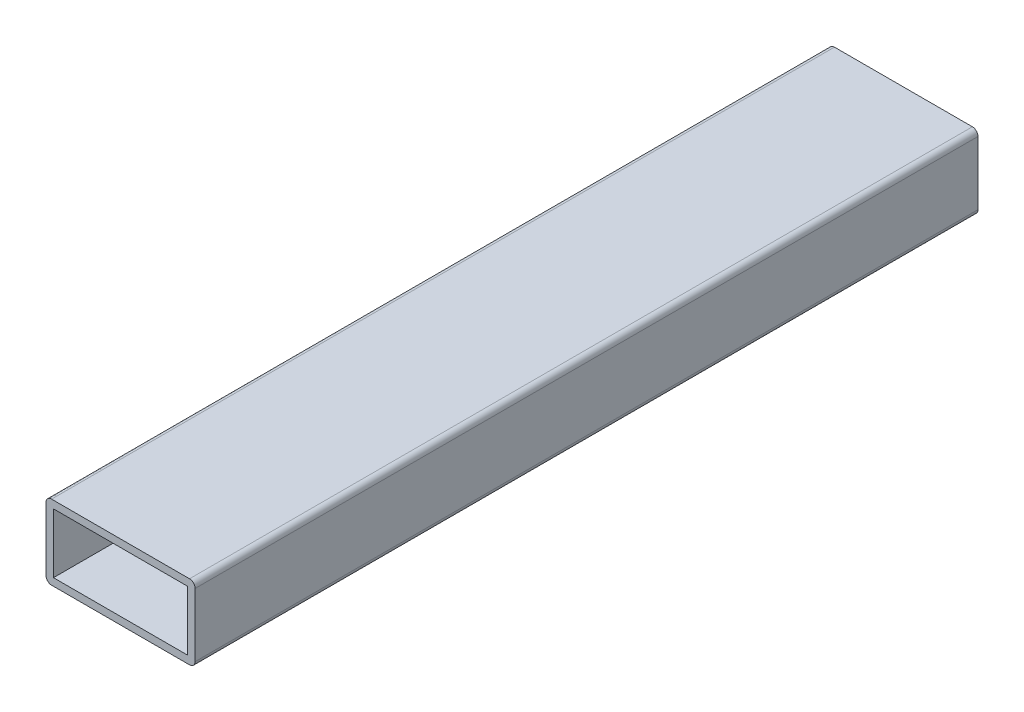
ISO-10303-21;
HEADER;
FILE_DESCRIPTION(('STEP AP214'),'2;1');
FILE_NAME('part.step','',(''),(''),'','','');
FILE_SCHEMA(('AUTOMOTIVE_DESIGN { 1 0 10303 214 1 1 1 1 }'));
ENDSEC;
DATA;
#1=APPLICATION_CONTEXT('core data for automotive mechanical design processes');
#2=APPLICATION_PROTOCOL_DEFINITION('international standard','automotive_design',2000,#1);
#3=PRODUCT_CONTEXT('',#1,'mechanical');
#4=PRODUCT('Part','Part','',(#3));
#5=PRODUCT_RELATED_PRODUCT_CATEGORY('part','',(#4));
#6=PRODUCT_DEFINITION_FORMATION('','',#4);
#7=PRODUCT_DEFINITION_CONTEXT('part definition',#1,'design');
#8=PRODUCT_DEFINITION('design','',#6,#7);
#9=PRODUCT_DEFINITION_SHAPE('','',#8);
#10=(LENGTH_UNIT() NAMED_UNIT(*) SI_UNIT(.MILLI.,.METRE.));
#11=(NAMED_UNIT(*) PLANE_ANGLE_UNIT() SI_UNIT($,.RADIAN.));
#12=(NAMED_UNIT(*) SI_UNIT($,.STERADIAN.) SOLID_ANGLE_UNIT());
#13=UNCERTAINTY_MEASURE_WITH_UNIT(LENGTH_MEASURE(1.E-05),#10,'distance_accuracy_value','');
#14=(GEOMETRIC_REPRESENTATION_CONTEXT(3) GLOBAL_UNCERTAINTY_ASSIGNED_CONTEXT((#13)) GLOBAL_UNIT_ASSIGNED_CONTEXT((#10,
#11,#12)) REPRESENTATION_CONTEXT('',''));
#15=CARTESIAN_POINT('',(0.,0.,0.));
#16=DIRECTION('',(0.,0.,1.));
#17=DIRECTION('',(1.,0.,0.));
#18=AXIS2_PLACEMENT_3D('',#15,#16,#17);
#19=CARTESIAN_POINT('',(37.,-17.,-210.));
#20=DIRECTION('',(0.,0.,1.));
#21=DIRECTION('',(1.,0.,0.));
#22=AXIS2_PLACEMENT_3D('',#19,#20,#21);
#23=CYLINDRICAL_SURFACE('',#22,3.00000000000001);
#24=DIRECTION('',(0.,0.,1.));
#25=VECTOR('',#24,1.);
#26=CARTESIAN_POINT('',(40.,-17.,-210.));
#27=LINE('',#26,#25);
#28=CARTESIAN_POINT('',(40.,-17.,-210.));
#29=VERTEX_POINT('',#28);
#30=CARTESIAN_POINT('',(40.,-17.,210.));
#31=VERTEX_POINT('',#30);
#32=EDGE_CURVE('E37',#29,#31,#27,.T.);
#33=ORIENTED_EDGE('',*,*,#32,.T.);
#34=CARTESIAN_POINT('',(37.,-17.,210.));
#35=DIRECTION('',(0.,0.,1.));
#36=DIRECTION('',(-1.,0.,0.));
#37=AXIS2_PLACEMENT_3D('',#34,#35,#36);
#38=CIRCLE('',#37,3.00000000000001);
#39=CARTESIAN_POINT('',(37.,-20.,210.));
#40=VERTEX_POINT('',#39);
#41=EDGE_CURVE('E153',#40,#31,#38,.T.);
#42=ORIENTED_EDGE('',*,*,#41,.F.);
#43=DIRECTION('',(0.,0.,1.));
#44=VECTOR('',#43,1.);
#45=CARTESIAN_POINT('',(37.,-20.,-210.));
#46=LINE('',#45,#44);
#47=CARTESIAN_POINT('',(37.,-20.,-210.));
#48=VERTEX_POINT('',#47);
#49=EDGE_CURVE('E11',#48,#40,#46,.T.);
#50=ORIENTED_EDGE('',*,*,#49,.F.);
#51=CARTESIAN_POINT('',(37.,-17.,-210.));
#52=DIRECTION('',(0.,0.,1.));
#53=DIRECTION('',(-1.,0.,0.));
#54=AXIS2_PLACEMENT_3D('',#51,#52,#53);
#55=CIRCLE('',#54,3.00000000000001);
#56=EDGE_CURVE('E184',#48,#29,#55,.T.);
#57=ORIENTED_EDGE('',*,*,#56,.T.);
#58=EDGE_LOOP('',(#33,#42,#50,#57));
#59=FACE_BOUND('',#58,.T.);
#60=ADVANCED_FACE('F34',(#59),#23,.T.);
#61=CARTESIAN_POINT('',(-37.,-20.,-210.));
#62=DIRECTION('',(0.,-1.,0.));
#63=DIRECTION('',(0.,0.,-1.));
#64=AXIS2_PLACEMENT_3D('',#61,#62,#63);
#65=PLANE('',#64);
#66=ORIENTED_EDGE('',*,*,#49,.T.);
#67=DIRECTION('',(1.,0.,0.));
#68=VECTOR('',#67,1.);
#69=CARTESIAN_POINT('',(-37.,-20.,210.));
#70=LINE('',#69,#68);
#71=CARTESIAN_POINT('',(-37.,-20.,210.));
#72=VERTEX_POINT('',#71);
#73=EDGE_CURVE('E174',#72,#40,#70,.T.);
#74=ORIENTED_EDGE('',*,*,#73,.F.);
#75=DIRECTION('',(0.,0.,1.));
#76=VECTOR('',#75,1.);
#77=CARTESIAN_POINT('',(-37.,-20.,-210.));
#78=LINE('',#77,#76);
#79=CARTESIAN_POINT('',(-37.,-20.,-210.));
#80=VERTEX_POINT('',#79);
#81=EDGE_CURVE('E42',#80,#72,#78,.T.);
#82=ORIENTED_EDGE('',*,*,#81,.F.);
#83=DIRECTION('',(1.,0.,0.));
#84=VECTOR('',#83,1.);
#85=CARTESIAN_POINT('',(-37.,-20.,-210.));
#86=LINE('',#85,#84);
#87=EDGE_CURVE('E207',#80,#48,#86,.T.);
#88=ORIENTED_EDGE('',*,*,#87,.T.);
#89=EDGE_LOOP('',(#66,#74,#82,#88));
#90=FACE_BOUND('',#89,.T.);
#91=ADVANCED_FACE('F228',(#90),#65,.T.);
#92=CARTESIAN_POINT('',(-37.,-17.,-210.));
#93=DIRECTION('',(0.,0.,1.));
#94=DIRECTION('',(1.,0.,0.));
#95=AXIS2_PLACEMENT_3D('',#92,#93,#94);
#96=CYLINDRICAL_SURFACE('',#95,3.);
#97=ORIENTED_EDGE('',*,*,#81,.T.);
#98=CARTESIAN_POINT('',(-37.,-17.,210.));
#99=DIRECTION('',(0.,0.,1.));
#100=DIRECTION('',(1.,0.,0.));
#101=AXIS2_PLACEMENT_3D('',#98,#99,#100);
#102=CIRCLE('',#101,3.);
#103=CARTESIAN_POINT('',(-40.,-17.,210.));
#104=VERTEX_POINT('',#103);
#105=EDGE_CURVE('E171',#104,#72,#102,.T.);
#106=ORIENTED_EDGE('',*,*,#105,.F.);
#107=DIRECTION('',(0.,0.,1.));
#108=VECTOR('',#107,1.);
#109=CARTESIAN_POINT('',(-40.,-17.,-210.));
#110=LINE('',#109,#108);
#111=CARTESIAN_POINT('',(-40.,-17.,-210.));
#112=VERTEX_POINT('',#111);
#113=EDGE_CURVE('E211',#112,#104,#110,.T.);
#114=ORIENTED_EDGE('',*,*,#113,.F.);
#115=CARTESIAN_POINT('',(-37.,-17.,-210.));
#116=DIRECTION('',(0.,0.,1.));
#117=DIRECTION('',(1.,0.,0.));
#118=AXIS2_PLACEMENT_3D('',#115,#116,#117);
#119=CIRCLE('',#118,3.);
#120=EDGE_CURVE('E204',#112,#80,#119,.T.);
#121=ORIENTED_EDGE('',*,*,#120,.T.);
#122=EDGE_LOOP('',(#97,#106,#114,#121));
#123=FACE_BOUND('',#122,.T.);
#124=ADVANCED_FACE('F249',(#123),#96,.T.);
#125=CARTESIAN_POINT('',(-40.,17.,-210.));
#126=DIRECTION('',(-1.,0.,0.));
#127=DIRECTION('',(0.,0.,1.));
#128=AXIS2_PLACEMENT_3D('',#125,#126,#127);
#129=PLANE('',#128);
#130=ORIENTED_EDGE('',*,*,#113,.T.);
#131=DIRECTION('',(0.,-1.,0.));
#132=VECTOR('',#131,1.);
#133=CARTESIAN_POINT('',(-40.,17.,210.));
#134=LINE('',#133,#132);
#135=CARTESIAN_POINT('',(-40.,17.,210.));
#136=VERTEX_POINT('',#135);
#137=EDGE_CURVE('E168',#136,#104,#134,.T.);
#138=ORIENTED_EDGE('',*,*,#137,.F.);
#139=DIRECTION('',(0.,0.,1.));
#140=VECTOR('',#139,1.);
#141=CARTESIAN_POINT('',(-40.,17.,-210.));
#142=LINE('',#141,#140);
#143=CARTESIAN_POINT('',(-40.,17.,-210.));
#144=VERTEX_POINT('',#143);
#145=EDGE_CURVE('E213',#144,#136,#142,.T.);
#146=ORIENTED_EDGE('',*,*,#145,.F.);
#147=DIRECTION('',(0.,-1.,0.));
#148=VECTOR('',#147,1.);
#149=CARTESIAN_POINT('',(-40.,17.,-210.));
#150=LINE('',#149,#148);
#151=EDGE_CURVE('E201',#144,#112,#150,.T.);
#152=ORIENTED_EDGE('',*,*,#151,.T.);
#153=EDGE_LOOP('',(#130,#138,#146,#152));
#154=FACE_BOUND('',#153,.T.);
#155=ADVANCED_FACE('F246',(#154),#129,.T.);
#156=CARTESIAN_POINT('',(-37.,17.,-210.));
#157=DIRECTION('',(0.,0.,1.));
#158=DIRECTION('',(1.,0.,0.));
#159=AXIS2_PLACEMENT_3D('',#156,#157,#158);
#160=CYLINDRICAL_SURFACE('',#159,3.);
#161=ORIENTED_EDGE('',*,*,#145,.T.);
#162=CARTESIAN_POINT('',(-37.,17.,210.));
#163=DIRECTION('',(0.,0.,1.));
#164=DIRECTION('',(1.,0.,0.));
#165=AXIS2_PLACEMENT_3D('',#162,#163,#164);
#166=CIRCLE('',#165,3.);
#167=CARTESIAN_POINT('',(-37.,20.,210.));
#168=VERTEX_POINT('',#167);
#169=EDGE_CURVE('E165',#168,#136,#166,.T.);
#170=ORIENTED_EDGE('',*,*,#169,.F.);
#171=DIRECTION('',(0.,0.,1.));
#172=VECTOR('',#171,1.);
#173=CARTESIAN_POINT('',(-37.,20.,-210.));
#174=LINE('',#173,#172);
#175=CARTESIAN_POINT('',(-37.,20.,-210.));
#176=VERTEX_POINT('',#175);
#177=EDGE_CURVE('E215',#176,#168,#174,.T.);
#178=ORIENTED_EDGE('',*,*,#177,.F.);
#179=CARTESIAN_POINT('',(-37.,17.,-210.));
#180=DIRECTION('',(0.,0.,1.));
#181=DIRECTION('',(1.,0.,0.));
#182=AXIS2_PLACEMENT_3D('',#179,#180,#181);
#183=CIRCLE('',#182,3.);
#184=EDGE_CURVE('E198',#176,#144,#183,.T.);
#185=ORIENTED_EDGE('',*,*,#184,.T.);
#186=EDGE_LOOP('',(#161,#170,#178,#185));
#187=FACE_BOUND('',#186,.T.);
#188=ADVANCED_FACE('F244',(#187),#160,.T.);
#189=CARTESIAN_POINT('',(-37.,20.,-210.));
#190=DIRECTION('',(0.,1.,0.));
#191=DIRECTION('',(-1.,0.,0.));
#192=AXIS2_PLACEMENT_3D('',#189,#190,#191);
#193=PLANE('',#192);
#194=ORIENTED_EDGE('',*,*,#177,.T.);
#195=DIRECTION('',(-1.,0.,0.));
#196=VECTOR('',#195,1.);
#197=CARTESIAN_POINT('',(-37.,20.,210.));
#198=LINE('',#197,#196);
#199=CARTESIAN_POINT('',(37.,20.,210.));
#200=VERTEX_POINT('',#199);
#201=EDGE_CURVE('E162',#200,#168,#198,.T.);
#202=ORIENTED_EDGE('',*,*,#201,.F.);
#203=DIRECTION('',(0.,0.,1.));
#204=VECTOR('',#203,1.);
#205=CARTESIAN_POINT('',(37.,20.,-210.));
#206=LINE('',#205,#204);
#207=CARTESIAN_POINT('',(37.,20.,-210.));
#208=VERTEX_POINT('',#207);
#209=EDGE_CURVE('E217',#208,#200,#206,.T.);
#210=ORIENTED_EDGE('',*,*,#209,.F.);
#211=DIRECTION('',(-1.,0.,0.));
#212=VECTOR('',#211,1.);
#213=CARTESIAN_POINT('',(-37.,20.,-210.));
#214=LINE('',#213,#212);
#215=EDGE_CURVE('E195',#208,#176,#214,.T.);
#216=ORIENTED_EDGE('',*,*,#215,.T.);
#217=EDGE_LOOP('',(#194,#202,#210,#216));
#218=FACE_BOUND('',#217,.T.);
#219=ADVANCED_FACE('F242',(#218),#193,.T.);
#220=CARTESIAN_POINT('',(37.,17.,-210.));
#221=DIRECTION('',(0.,0.,1.));
#222=DIRECTION('',(1.,0.,0.));
#223=AXIS2_PLACEMENT_3D('',#220,#221,#222);
#224=CYLINDRICAL_SURFACE('',#223,3.);
#225=ORIENTED_EDGE('',*,*,#209,.T.);
#226=CARTESIAN_POINT('',(37.,17.,210.));
#227=DIRECTION('',(0.,0.,1.));
#228=DIRECTION('',(-1.,0.,0.));
#229=AXIS2_PLACEMENT_3D('',#226,#227,#228);
#230=CIRCLE('',#229,3.);
#231=CARTESIAN_POINT('',(40.,17.,210.));
#232=VERTEX_POINT('',#231);
#233=EDGE_CURVE('E159',#232,#200,#230,.T.);
#234=ORIENTED_EDGE('',*,*,#233,.F.);
#235=DIRECTION('',(0.,0.,1.));
#236=VECTOR('',#235,1.);
#237=CARTESIAN_POINT('',(40.,17.,-210.));
#238=LINE('',#237,#236);
#239=CARTESIAN_POINT('',(40.,17.,-210.));
#240=VERTEX_POINT('',#239);
#241=EDGE_CURVE('E218',#240,#232,#238,.T.);
#242=ORIENTED_EDGE('',*,*,#241,.F.);
#243=CARTESIAN_POINT('',(37.,17.,-210.));
#244=DIRECTION('',(0.,0.,1.));
#245=DIRECTION('',(-1.,0.,0.));
#246=AXIS2_PLACEMENT_3D('',#243,#244,#245);
#247=CIRCLE('',#246,3.);
#248=EDGE_CURVE('E192',#240,#208,#247,.T.);
#249=ORIENTED_EDGE('',*,*,#248,.T.);
#250=EDGE_LOOP('',(#225,#234,#242,#249));
#251=FACE_BOUND('',#250,.T.);
#252=ADVANCED_FACE('F238',(#251),#224,.T.);
#253=CARTESIAN_POINT('',(40.,17.,-210.));
#254=DIRECTION('',(1.,0.,0.));
#255=DIRECTION('',(0.,1.,0.));
#256=AXIS2_PLACEMENT_3D('',#253,#254,#255);
#257=PLANE('',#256);
#258=ORIENTED_EDGE('',*,*,#241,.T.);
#259=DIRECTION('',(0.,1.,0.));
#260=VECTOR('',#259,1.);
#261=CARTESIAN_POINT('',(40.,17.,210.));
#262=LINE('',#261,#260);
#263=EDGE_CURVE('E156',#31,#232,#262,.T.);
#264=ORIENTED_EDGE('',*,*,#263,.F.);
#265=ORIENTED_EDGE('',*,*,#32,.F.);
#266=DIRECTION('',(0.,1.,0.));
#267=VECTOR('',#266,1.);
#268=CARTESIAN_POINT('',(40.,17.,-210.));
#269=LINE('',#268,#267);
#270=EDGE_CURVE('E189',#29,#240,#269,.T.);
#271=ORIENTED_EDGE('',*,*,#270,.T.);
#272=EDGE_LOOP('',(#258,#264,#265,#271));
#273=FACE_BOUND('',#272,.T.);
#274=ADVANCED_FACE('F222',(#273),#257,.T.);
#275=CARTESIAN_POINT('',(37.,-17.,-210.));
#276=DIRECTION('',(0.,0.,-1.));
#277=DIRECTION('',(-1.,0.,0.));
#278=AXIS2_PLACEMENT_3D('',#275,#276,#277);
#279=PLANE('',#278);
#280=DIRECTION('',(0.,-1.,0.));
#281=VECTOR('',#280,1.);
#282=CARTESIAN_POINT('',(-36.,16.,-210.));
#283=LINE('',#282,#281);
#284=CARTESIAN_POINT('',(-36.,16.,-210.));
#285=VERTEX_POINT('',#284);
#286=CARTESIAN_POINT('',(-36.,-16.,-210.));
#287=VERTEX_POINT('',#286);
#288=EDGE_CURVE('E177',#285,#287,#283,.T.);
#289=ORIENTED_EDGE('',*,*,#288,.T.);
#290=DIRECTION('',(1.,0.,0.));
#291=VECTOR('',#290,1.);
#292=CARTESIAN_POINT('',(-36.,-16.,-210.));
#293=LINE('',#292,#291);
#294=CARTESIAN_POINT('',(36.,-16.,-210.));
#295=VERTEX_POINT('',#294);
#296=EDGE_CURVE('E130',#287,#295,#293,.T.);
#297=ORIENTED_EDGE('',*,*,#296,.T.);
#298=DIRECTION('',(0.,1.,0.));
#299=VECTOR('',#298,1.);
#300=CARTESIAN_POINT('',(36.,16.,-210.));
#301=LINE('',#300,#299);
#302=CARTESIAN_POINT('',(36.,16.,-210.));
#303=VERTEX_POINT('',#302);
#304=EDGE_CURVE('E50',#295,#303,#301,.T.);
#305=ORIENTED_EDGE('',*,*,#304,.T.);
#306=DIRECTION('',(-1.,0.,0.));
#307=VECTOR('',#306,1.);
#308=CARTESIAN_POINT('',(-36.,16.,-210.));
#309=LINE('',#308,#307);
#310=EDGE_CURVE('E135',#303,#285,#309,.T.);
#311=ORIENTED_EDGE('',*,*,#310,.T.);
#312=EDGE_LOOP('',(#289,#297,#305,#311));
#313=FACE_BOUND('',#312,.T.);
#314=ORIENTED_EDGE('',*,*,#56,.F.);
#315=ORIENTED_EDGE('',*,*,#87,.F.);
#316=ORIENTED_EDGE('',*,*,#120,.F.);
#317=ORIENTED_EDGE('',*,*,#151,.F.);
#318=ORIENTED_EDGE('',*,*,#184,.F.);
#319=ORIENTED_EDGE('',*,*,#215,.F.);
#320=ORIENTED_EDGE('',*,*,#248,.F.);
#321=ORIENTED_EDGE('',*,*,#270,.F.);
#322=EDGE_LOOP('',(#314,#315,#316,#317,#318,#319,#320,#321));
#323=FACE_BOUND('',#322,.T.);
#324=ADVANCED_FACE('F232',(#313,#323),#279,.T.);
#325=CARTESIAN_POINT('',(-36.,16.,-210.));
#326=DIRECTION('',(-1.,0.,0.));
#327=DIRECTION('',(0.,-1.,0.));
#328=AXIS2_PLACEMENT_3D('',#325,#326,#327);
#329=PLANE('',#328);
#330=DIRECTION('',(0.,0.,1.));
#331=VECTOR('',#330,1.);
#332=CARTESIAN_POINT('',(-36.,16.,-210.));
#333=LINE('',#332,#331);
#334=CARTESIAN_POINT('',(-36.,16.,210.));
#335=VERTEX_POINT('',#334);
#336=EDGE_CURVE('E140',#285,#335,#333,.T.);
#337=ORIENTED_EDGE('',*,*,#336,.T.);
#338=DIRECTION('',(0.,-1.,0.));
#339=VECTOR('',#338,1.);
#340=CARTESIAN_POINT('',(-36.,16.,210.));
#341=LINE('',#340,#339);
#342=CARTESIAN_POINT('',(-36.,-16.,210.));
#343=VERTEX_POINT('',#342);
#344=EDGE_CURVE('E138',#335,#343,#341,.T.);
#345=ORIENTED_EDGE('',*,*,#344,.T.);
#346=DIRECTION('',(0.,0.,1.));
#347=VECTOR('',#346,1.);
#348=CARTESIAN_POINT('',(-36.,-16.,-210.));
#349=LINE('',#348,#347);
#350=EDGE_CURVE('E123',#287,#343,#349,.T.);
#351=ORIENTED_EDGE('',*,*,#350,.F.);
#352=ORIENTED_EDGE('',*,*,#288,.F.);
#353=EDGE_LOOP('',(#337,#345,#351,#352));
#354=FACE_BOUND('',#353,.T.);
#355=ADVANCED_FACE('F139',(#354),#329,.F.);
#356=CARTESIAN_POINT('',(-36.,16.,-210.));
#357=DIRECTION('',(0.,1.,0.));
#358=DIRECTION('',(0.,0.,1.));
#359=AXIS2_PLACEMENT_3D('',#356,#357,#358);
#360=PLANE('',#359);
#361=DIRECTION('',(0.,0.,1.));
#362=VECTOR('',#361,1.);
#363=CARTESIAN_POINT('',(36.,16.,-210.));
#364=LINE('',#363,#362);
#365=CARTESIAN_POINT('',(36.,16.,210.));
#366=VERTEX_POINT('',#365);
#367=EDGE_CURVE('E185',#303,#366,#364,.T.);
#368=ORIENTED_EDGE('',*,*,#367,.T.);
#369=DIRECTION('',(-1.,0.,0.));
#370=VECTOR('',#369,1.);
#371=CARTESIAN_POINT('',(-36.,16.,210.));
#372=LINE('',#371,#370);
#373=EDGE_CURVE('E149',#366,#335,#372,.T.);
#374=ORIENTED_EDGE('',*,*,#373,.T.);
#375=ORIENTED_EDGE('',*,*,#336,.F.);
#376=ORIENTED_EDGE('',*,*,#310,.F.);
#377=EDGE_LOOP('',(#368,#374,#375,#376));
#378=FACE_BOUND('',#377,.T.);
#379=ADVANCED_FACE('F324',(#378),#360,.F.);
#380=CARTESIAN_POINT('',(36.,16.,-210.));
#381=DIRECTION('',(1.,0.,0.));
#382=DIRECTION('',(0.,0.,-1.));
#383=AXIS2_PLACEMENT_3D('',#380,#381,#382);
#384=PLANE('',#383);
#385=DIRECTION('',(0.,0.,1.));
#386=VECTOR('',#385,1.);
#387=CARTESIAN_POINT('',(36.,-16.,-210.));
#388=LINE('',#387,#386);
#389=CARTESIAN_POINT('',(36.,-16.,210.));
#390=VERTEX_POINT('',#389);
#391=EDGE_CURVE('E134',#295,#390,#388,.T.);
#392=ORIENTED_EDGE('',*,*,#391,.T.);
#393=DIRECTION('',(0.,1.,0.));
#394=VECTOR('',#393,1.);
#395=CARTESIAN_POINT('',(36.,16.,210.));
#396=LINE('',#395,#394);
#397=EDGE_CURVE('E147',#390,#366,#396,.T.);
#398=ORIENTED_EDGE('',*,*,#397,.T.);
#399=ORIENTED_EDGE('',*,*,#367,.F.);
#400=ORIENTED_EDGE('',*,*,#304,.F.);
#401=EDGE_LOOP('',(#392,#398,#399,#400));
#402=FACE_BOUND('',#401,.T.);
#403=ADVANCED_FACE('F333',(#402),#384,.F.);
#404=CARTESIAN_POINT('',(-36.,-16.,-210.));
#405=DIRECTION('',(0.,-1.,0.));
#406=DIRECTION('',(1.,0.,0.));
#407=AXIS2_PLACEMENT_3D('',#404,#405,#406);
#408=PLANE('',#407);
#409=ORIENTED_EDGE('',*,*,#350,.T.);
#410=DIRECTION('',(1.,0.,0.));
#411=VECTOR('',#410,1.);
#412=CARTESIAN_POINT('',(-36.,-16.,210.));
#413=LINE('',#412,#411);
#414=EDGE_CURVE('E127',#343,#390,#413,.T.);
#415=ORIENTED_EDGE('',*,*,#414,.T.);
#416=ORIENTED_EDGE('',*,*,#391,.F.);
#417=ORIENTED_EDGE('',*,*,#296,.F.);
#418=EDGE_LOOP('',(#409,#415,#416,#417));
#419=FACE_BOUND('',#418,.T.);
#420=ADVANCED_FACE('F125',(#419),#408,.F.);
#421=CARTESIAN_POINT('',(37.,-17.,210.));
#422=DIRECTION('',(0.,0.,-1.));
#423=DIRECTION('',(-1.,0.,0.));
#424=AXIS2_PLACEMENT_3D('',#421,#422,#423);
#425=PLANE('',#424);
#426=ORIENTED_EDGE('',*,*,#41,.T.);
#427=ORIENTED_EDGE('',*,*,#263,.T.);
#428=ORIENTED_EDGE('',*,*,#233,.T.);
#429=ORIENTED_EDGE('',*,*,#201,.T.);
#430=ORIENTED_EDGE('',*,*,#169,.T.);
#431=ORIENTED_EDGE('',*,*,#137,.T.);
#432=ORIENTED_EDGE('',*,*,#105,.T.);
#433=ORIENTED_EDGE('',*,*,#73,.T.);
#434=EDGE_LOOP('',(#426,#427,#428,#429,#430,#431,#432,#433));
#435=FACE_BOUND('',#434,.T.);
#436=ORIENTED_EDGE('',*,*,#344,.F.);
#437=ORIENTED_EDGE('',*,*,#373,.F.);
#438=ORIENTED_EDGE('',*,*,#397,.F.);
#439=ORIENTED_EDGE('',*,*,#414,.F.);
#440=EDGE_LOOP('',(#436,#437,#438,#439));
#441=FACE_BOUND('',#440,.T.);
#442=ADVANCED_FACE('F145',(#435,#441),#425,.F.);
#443=CLOSED_SHELL('',(#60,#91,#124,#155,#188,#219,#252,#274,#324,#355,#379,#403,#420,#442));
#444=MANIFOLD_SOLID_BREP('B2',#443);
#445=ADVANCED_BREP_SHAPE_REPRESENTATION('',(#18,#444),#14);
#446=SHAPE_DEFINITION_REPRESENTATION(#9,#445);
ENDSEC;
END-ISO-10303-21;
